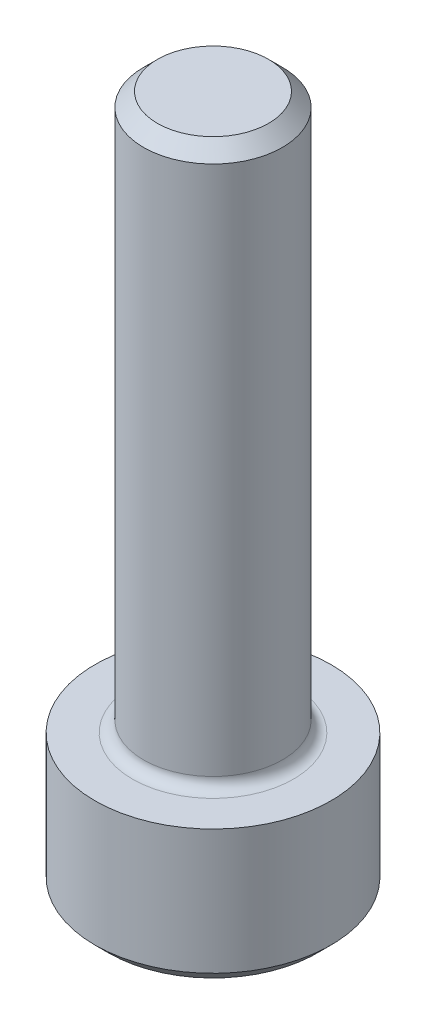
ISO-10303-21;
HEADER;
FILE_DESCRIPTION(('STEP AP214'),'2;1');
FILE_NAME('part.step','',(''),(''),'','','');
FILE_SCHEMA(('AUTOMOTIVE_DESIGN { 1 0 10303 214 1 1 1 1 }'));
ENDSEC;
DATA;
#1=APPLICATION_CONTEXT('core data for automotive mechanical design processes');
#2=APPLICATION_PROTOCOL_DEFINITION('international standard','automotive_design',2000,#1);
#3=PRODUCT_CONTEXT('',#1,'mechanical');
#4=PRODUCT('Part','Part','',(#3));
#5=PRODUCT_RELATED_PRODUCT_CATEGORY('part','',(#4));
#6=PRODUCT_DEFINITION_FORMATION('','',#4);
#7=PRODUCT_DEFINITION_CONTEXT('part definition',#1,'design');
#8=PRODUCT_DEFINITION('design','',#6,#7);
#9=PRODUCT_DEFINITION_SHAPE('','',#8);
#10=(LENGTH_UNIT() NAMED_UNIT(*) SI_UNIT(.MILLI.,.METRE.));
#11=(NAMED_UNIT(*) PLANE_ANGLE_UNIT() SI_UNIT($,.RADIAN.));
#12=(NAMED_UNIT(*) SI_UNIT($,.STERADIAN.) SOLID_ANGLE_UNIT());
#13=UNCERTAINTY_MEASURE_WITH_UNIT(LENGTH_MEASURE(1.E-05),#10,'distance_accuracy_value','');
#14=(GEOMETRIC_REPRESENTATION_CONTEXT(3) GLOBAL_UNCERTAINTY_ASSIGNED_CONTEXT((#13)) GLOBAL_UNIT_ASSIGNED_CONTEXT((#10,
#11,#12)) REPRESENTATION_CONTEXT('',''));
#15=CARTESIAN_POINT('',(0.,0.,0.));
#16=DIRECTION('',(0.,0.,1.));
#17=DIRECTION('',(1.,0.,0.));
#18=AXIS2_PLACEMENT_3D('',#15,#16,#17);
#19=CARTESIAN_POINT('',(0.,20.,0.));
#20=DIRECTION('',(0.,-1.,0.));
#21=DIRECTION('',(0.,0.,-1.));
#22=AXIS2_PLACEMENT_3D('',#19,#20,#21);
#23=CYLINDRICAL_SURFACE('',#22,2.5);
#24=CARTESIAN_POINT('',(0.,19.5,0.));
#25=DIRECTION('',(0.,1.,0.));
#26=DIRECTION('',(0.,0.,1.));
#27=AXIS2_PLACEMENT_3D('',#24,#25,#26);
#28=CIRCLE('',#27,2.5);
#29=CARTESIAN_POINT('',(0.,19.5,2.5));
#30=VERTEX_POINT('',#29);
#31=EDGE_CURVE('E11',#30,#30,#28,.F.);
#32=ORIENTED_EDGE('',*,*,#31,.T.);
#33=EDGE_LOOP('',(#32));
#34=FACE_BOUND('',#33,.T.);
#35=CARTESIAN_POINT('',(0.,0.400000000000001,0.));
#36=DIRECTION('',(0.,1.,0.));
#37=DIRECTION('',(0.,0.,1.));
#38=AXIS2_PLACEMENT_3D('',#35,#36,#37);
#39=CIRCLE('',#38,2.5);
#40=CARTESIAN_POINT('',(0.,0.400000000000001,2.5));
#41=VERTEX_POINT('',#40);
#42=EDGE_CURVE('E143',#41,#41,#39,.T.);
#43=ORIENTED_EDGE('',*,*,#42,.T.);
#44=EDGE_LOOP('',(#43));
#45=FACE_BOUND('',#44,.T.);
#46=ADVANCED_FACE('F33',(#34,#45),#23,.T.);
#47=CARTESIAN_POINT('',(0.,20.,0.));
#48=DIRECTION('',(0.,1.,0.));
#49=DIRECTION('',(0.,0.,1.));
#50=AXIS2_PLACEMENT_3D('',#47,#48,#49);
#51=PLANE('',#50);
#52=CARTESIAN_POINT('',(0.,20.,0.));
#53=DIRECTION('',(0.,1.,0.));
#54=DIRECTION('',(0.,0.,1.));
#55=AXIS2_PLACEMENT_3D('',#52,#53,#54);
#56=CIRCLE('',#55,2.);
#57=CARTESIAN_POINT('',(0.,20.,2.));
#58=VERTEX_POINT('',#57);
#59=EDGE_CURVE('E41',#58,#58,#56,.T.);
#60=ORIENTED_EDGE('',*,*,#59,.T.);
#61=EDGE_LOOP('',(#60));
#62=FACE_BOUND('',#61,.T.);
#63=ADVANCED_FACE('F157',(#62),#51,.T.);
#64=CARTESIAN_POINT('',(0.,-5.,0.));
#65=DIRECTION('',(0.,1.,0.));
#66=DIRECTION('',(0.,0.,1.));
#67=AXIS2_PLACEMENT_3D('',#64,#65,#66);
#68=CYLINDRICAL_SURFACE('',#67,4.25);
#69=CARTESIAN_POINT('',(0.,-4.49999999999999,0.));
#70=DIRECTION('',(0.,1.,0.));
#71=DIRECTION('',(0.,0.,1.));
#72=AXIS2_PLACEMENT_3D('',#69,#70,#71);
#73=CIRCLE('',#72,4.25);
#74=CARTESIAN_POINT('',(0.,-4.49999999999999,4.25));
#75=VERTEX_POINT('',#74);
#76=EDGE_CURVE('E149',#75,#75,#73,.T.);
#77=ORIENTED_EDGE('',*,*,#76,.T.);
#78=EDGE_LOOP('',(#77));
#79=FACE_BOUND('',#78,.T.);
#80=CARTESIAN_POINT('',(0.,0.,0.));
#81=DIRECTION('',(0.,1.,0.));
#82=DIRECTION('',(0.,0.,1.));
#83=AXIS2_PLACEMENT_3D('',#80,#81,#82);
#84=CIRCLE('',#83,4.25);
#85=CARTESIAN_POINT('',(0.,0.,4.25));
#86=VERTEX_POINT('',#85);
#87=EDGE_CURVE('E135',#86,#86,#84,.T.);
#88=ORIENTED_EDGE('',*,*,#87,.F.);
#89=EDGE_LOOP('',(#88));
#90=FACE_BOUND('',#89,.T.);
#91=ADVANCED_FACE('F178',(#79,#90),#68,.T.);
#92=CARTESIAN_POINT('',(0.,-5.,0.));
#93=DIRECTION('',(0.,1.,0.));
#94=DIRECTION('',(0.,0.,1.));
#95=AXIS2_PLACEMENT_3D('',#92,#93,#94);
#96=PLANE('',#95);
#97=DIRECTION('',(-0.866025403784439,0.,-0.5));
#98=VECTOR('',#97,1.);
#99=CARTESIAN_POINT('',(0.,-5.,2.3094010767585));
#100=LINE('',#99,#98);
#101=CARTESIAN_POINT('',(0.,-5.,2.3094010767585));
#102=VERTEX_POINT('',#101);
#103=CARTESIAN_POINT('',(-2.,-5.,1.15470053837925));
#104=VERTEX_POINT('',#103);
#105=EDGE_CURVE('E122',#102,#104,#100,.T.);
#106=ORIENTED_EDGE('',*,*,#105,.F.);
#107=DIRECTION('',(-0.866025403784439,0.,0.5));
#108=VECTOR('',#107,1.);
#109=CARTESIAN_POINT('',(2.,-5.,1.15470053837925));
#110=LINE('',#109,#108);
#111=CARTESIAN_POINT('',(2.,-5.,1.15470053837925));
#112=VERTEX_POINT('',#111);
#113=EDGE_CURVE('E48',#112,#102,#110,.T.);
#114=ORIENTED_EDGE('',*,*,#113,.F.);
#115=DIRECTION('',(0.,0.,1.));
#116=VECTOR('',#115,1.);
#117=CARTESIAN_POINT('',(2.,-5.,-1.15470053837925));
#118=LINE('',#117,#116);
#119=CARTESIAN_POINT('',(2.,-5.,-1.15470053837925));
#120=VERTEX_POINT('',#119);
#121=EDGE_CURVE('E131',#120,#112,#118,.T.);
#122=ORIENTED_EDGE('',*,*,#121,.F.);
#123=DIRECTION('',(0.866025403784439,0.,0.5));
#124=VECTOR('',#123,1.);
#125=CARTESIAN_POINT('',(0.,-5.,-2.3094010767585));
#126=LINE('',#125,#124);
#127=CARTESIAN_POINT('',(0.,-5.,-2.3094010767585));
#128=VERTEX_POINT('',#127);
#129=EDGE_CURVE('E129',#128,#120,#126,.T.);
#130=ORIENTED_EDGE('',*,*,#129,.F.);
#131=DIRECTION('',(0.866025403784439,0.,-0.5));
#132=VECTOR('',#131,1.);
#133=CARTESIAN_POINT('',(-2.,-5.,-1.15470053837925));
#134=LINE('',#133,#132);
#135=CARTESIAN_POINT('',(-2.,-5.,-1.15470053837925));
#136=VERTEX_POINT('',#135);
#137=EDGE_CURVE('E96',#136,#128,#134,.T.);
#138=ORIENTED_EDGE('',*,*,#137,.F.);
#139=DIRECTION('',(0.,0.,-1.));
#140=VECTOR('',#139,1.);
#141=CARTESIAN_POINT('',(-2.,-5.,1.15470053837925));
#142=LINE('',#141,#140);
#143=EDGE_CURVE('E125',#104,#136,#142,.T.);
#144=ORIENTED_EDGE('',*,*,#143,.F.);
#145=EDGE_LOOP('',(#106,#114,#122,#130,#138,#144));
#146=FACE_BOUND('',#145,.T.);
#147=CARTESIAN_POINT('',(0.,-5.,0.));
#148=DIRECTION('',(0.,1.,0.));
#149=DIRECTION('',(0.,0.,1.));
#150=AXIS2_PLACEMENT_3D('',#147,#148,#149);
#151=CIRCLE('',#150,3.75);
#152=CARTESIAN_POINT('',(0.,-5.,3.75));
#153=VERTEX_POINT('',#152);
#154=EDGE_CURVE('E152',#153,#153,#151,.F.);
#155=ORIENTED_EDGE('',*,*,#154,.T.);
#156=EDGE_LOOP('',(#155));
#157=FACE_BOUND('',#156,.T.);
#158=ADVANCED_FACE('F189',(#146,#157),#96,.F.);
#159=CARTESIAN_POINT('',(0.,0.,0.));
#160=DIRECTION('',(0.,1.,0.));
#161=DIRECTION('',(0.,0.,1.));
#162=AXIS2_PLACEMENT_3D('',#159,#160,#161);
#163=PLANE('',#162);
#164=CARTESIAN_POINT('',(0.,0.,0.));
#165=DIRECTION('',(0.,1.,0.));
#166=DIRECTION('',(0.,0.,1.));
#167=AXIS2_PLACEMENT_3D('',#164,#165,#166);
#168=CIRCLE('',#167,2.9);
#169=CARTESIAN_POINT('',(0.,0.,2.9));
#170=VERTEX_POINT('',#169);
#171=EDGE_CURVE('E146',#170,#170,#168,.F.);
#172=ORIENTED_EDGE('',*,*,#171,.T.);
#173=EDGE_LOOP('',(#172));
#174=FACE_BOUND('',#173,.T.);
#175=ORIENTED_EDGE('',*,*,#87,.T.);
#176=EDGE_LOOP('',(#175));
#177=FACE_BOUND('',#176,.T.);
#178=ADVANCED_FACE('F184',(#174,#177),#163,.T.);
#179=CARTESIAN_POINT('',(0.,0.400000000000001,0.));
#180=DIRECTION('',(0.,1.,0.));
#181=DIRECTION('',(0.,0.,1.));
#182=AXIS2_PLACEMENT_3D('',#179,#180,#181);
#183=TOROIDAL_SURFACE('',#182,2.9,0.4);
#184=ORIENTED_EDGE('',*,*,#171,.F.);
#185=EDGE_LOOP('',(#184));
#186=FACE_BOUND('',#185,.T.);
#187=ORIENTED_EDGE('',*,*,#42,.F.);
#188=EDGE_LOOP('',(#187));
#189=FACE_BOUND('',#188,.T.);
#190=ADVANCED_FACE('F169',(#186,#189),#183,.F.);
#191=CARTESIAN_POINT('',(0.,-4.49999999999999,0.));
#192=DIRECTION('',(0.,1.,0.));
#193=DIRECTION('',(0.,0.,1.));
#194=AXIS2_PLACEMENT_3D('',#191,#192,#193);
#195=CONICAL_SURFACE('',#194,4.25,0.785398163397446);
#196=ORIENTED_EDGE('',*,*,#154,.F.);
#197=EDGE_LOOP('',(#196));
#198=FACE_BOUND('',#197,.T.);
#199=ORIENTED_EDGE('',*,*,#76,.F.);
#200=EDGE_LOOP('',(#199));
#201=FACE_BOUND('',#200,.T.);
#202=ADVANCED_FACE('F161',(#198,#201),#195,.T.);
#203=CARTESIAN_POINT('',(0.,20.,0.));
#204=DIRECTION('',(0.,-1.,0.));
#205=DIRECTION('',(0.,0.,-1.));
#206=AXIS2_PLACEMENT_3D('',#203,#204,#205);
#207=CONICAL_SURFACE('',#206,2.,0.785398163397447);
#208=ORIENTED_EDGE('',*,*,#31,.F.);
#209=EDGE_LOOP('',(#208));
#210=FACE_BOUND('',#209,.T.);
#211=ORIENTED_EDGE('',*,*,#59,.F.);
#212=EDGE_LOOP('',(#211));
#213=FACE_BOUND('',#212,.T.);
#214=ADVANCED_FACE('F35',(#210,#213),#207,.T.);
#215=CARTESIAN_POINT('',(2.,-2.5,1.15470053837925));
#216=DIRECTION('',(0.5,0.,0.866025403784439));
#217=DIRECTION('',(0.866025403784439,0.,-0.5));
#218=AXIS2_PLACEMENT_3D('',#215,#216,#217);
#219=PLANE('',#218);
#220=ORIENTED_EDGE('',*,*,#113,.T.);
#221=DIRECTION('',(0.,-1.,0.));
#222=VECTOR('',#221,1.);
#223=CARTESIAN_POINT('',(0.,-2.5,2.3094010767585));
#224=LINE('',#223,#222);
#225=CARTESIAN_POINT('',(0.,-2.5,2.3094010767585));
#226=VERTEX_POINT('',#225);
#227=EDGE_CURVE('E78',#226,#102,#224,.T.);
#228=ORIENTED_EDGE('',*,*,#227,.F.);
#229=DIRECTION('',(-0.866025403784439,0.,0.5));
#230=VECTOR('',#229,1.);
#231=CARTESIAN_POINT('',(2.,-2.5,1.15470053837925));
#232=LINE('',#231,#230);
#233=CARTESIAN_POINT('',(2.,-2.5,1.15470053837925));
#234=VERTEX_POINT('',#233);
#235=EDGE_CURVE('E133',#234,#226,#232,.T.);
#236=ORIENTED_EDGE('',*,*,#235,.F.);
#237=DIRECTION('',(0.,-1.,0.));
#238=VECTOR('',#237,1.);
#239=CARTESIAN_POINT('',(2.,-2.5,1.15470053837925));
#240=LINE('',#239,#238);
#241=EDGE_CURVE('E56',#234,#112,#240,.T.);
#242=ORIENTED_EDGE('',*,*,#241,.T.);
#243=EDGE_LOOP('',(#220,#228,#236,#242));
#244=FACE_BOUND('',#243,.T.);
#245=ADVANCED_FACE('F160',(#244),#219,.F.);
#246=CARTESIAN_POINT('',(2.,-2.5,-1.15470053837925));
#247=DIRECTION('',(1.,0.,0.));
#248=DIRECTION('',(0.,0.,-1.));
#249=AXIS2_PLACEMENT_3D('',#246,#247,#248);
#250=PLANE('',#249);
#251=ORIENTED_EDGE('',*,*,#121,.T.);
#252=ORIENTED_EDGE('',*,*,#241,.F.);
#253=DIRECTION('',(0.,0.,1.));
#254=VECTOR('',#253,1.);
#255=CARTESIAN_POINT('',(2.,-2.5,-1.15470053837925));
#256=LINE('',#255,#254);
#257=CARTESIAN_POINT('',(2.,-2.5,-1.15470053837925));
#258=VERTEX_POINT('',#257);
#259=EDGE_CURVE('E108',#258,#234,#256,.T.);
#260=ORIENTED_EDGE('',*,*,#259,.F.);
#261=DIRECTION('',(0.,-1.,0.));
#262=VECTOR('',#261,1.);
#263=CARTESIAN_POINT('',(2.,-2.5,-1.15470053837925));
#264=LINE('',#263,#262);
#265=EDGE_CURVE('E100',#258,#120,#264,.T.);
#266=ORIENTED_EDGE('',*,*,#265,.T.);
#267=EDGE_LOOP('',(#251,#252,#260,#266));
#268=FACE_BOUND('',#267,.T.);
#269=ADVANCED_FACE('F167',(#268),#250,.F.);
#270=CARTESIAN_POINT('',(0.,-2.5,-2.3094010767585));
#271=DIRECTION('',(0.5,0.,-0.866025403784439));
#272=DIRECTION('',(-0.866025403784439,0.,-0.5));
#273=AXIS2_PLACEMENT_3D('',#270,#271,#272);
#274=PLANE('',#273);
#275=ORIENTED_EDGE('',*,*,#129,.T.);
#276=ORIENTED_EDGE('',*,*,#265,.F.);
#277=DIRECTION('',(0.866025403784439,0.,0.5));
#278=VECTOR('',#277,1.);
#279=CARTESIAN_POINT('',(0.,-2.5,-2.3094010767585));
#280=LINE('',#279,#278);
#281=CARTESIAN_POINT('',(0.,-2.5,-2.3094010767585));
#282=VERTEX_POINT('',#281);
#283=EDGE_CURVE('E104',#282,#258,#280,.T.);
#284=ORIENTED_EDGE('',*,*,#283,.F.);
#285=DIRECTION('',(0.,-1.,0.));
#286=VECTOR('',#285,1.);
#287=CARTESIAN_POINT('',(0.,-2.5,-2.3094010767585));
#288=LINE('',#287,#286);
#289=EDGE_CURVE('E89',#282,#128,#288,.T.);
#290=ORIENTED_EDGE('',*,*,#289,.T.);
#291=EDGE_LOOP('',(#275,#276,#284,#290));
#292=FACE_BOUND('',#291,.T.);
#293=ADVANCED_FACE('F105',(#292),#274,.F.);
#294=CARTESIAN_POINT('',(-2.,-2.5,-1.15470053837925));
#295=DIRECTION('',(-0.5,0.,-0.866025403784439));
#296=DIRECTION('',(-0.866025403784439,0.,0.5));
#297=AXIS2_PLACEMENT_3D('',#294,#295,#296);
#298=PLANE('',#297);
#299=ORIENTED_EDGE('',*,*,#137,.T.);
#300=ORIENTED_EDGE('',*,*,#289,.F.);
#301=DIRECTION('',(0.866025403784439,0.,-0.5));
#302=VECTOR('',#301,1.);
#303=CARTESIAN_POINT('',(-2.,-2.5,-1.15470053837925));
#304=LINE('',#303,#302);
#305=CARTESIAN_POINT('',(-2.,-2.5,-1.15470053837925));
#306=VERTEX_POINT('',#305);
#307=EDGE_CURVE('E93',#306,#282,#304,.T.);
#308=ORIENTED_EDGE('',*,*,#307,.F.);
#309=DIRECTION('',(0.,-1.,0.));
#310=VECTOR('',#309,1.);
#311=CARTESIAN_POINT('',(-2.,-2.5,-1.15470053837925));
#312=LINE('',#311,#310);
#313=EDGE_CURVE('E101',#306,#136,#312,.T.);
#314=ORIENTED_EDGE('',*,*,#313,.T.);
#315=EDGE_LOOP('',(#299,#300,#308,#314));
#316=FACE_BOUND('',#315,.T.);
#317=ADVANCED_FACE('F91',(#316),#298,.F.);
#318=CARTESIAN_POINT('',(-2.,-2.5,1.15470053837925));
#319=DIRECTION('',(-1.,0.,0.));
#320=DIRECTION('',(0.,0.,1.));
#321=AXIS2_PLACEMENT_3D('',#318,#319,#320);
#322=PLANE('',#321);
#323=ORIENTED_EDGE('',*,*,#143,.T.);
#324=ORIENTED_EDGE('',*,*,#313,.F.);
#325=DIRECTION('',(0.,0.,-1.));
#326=VECTOR('',#325,1.);
#327=CARTESIAN_POINT('',(-2.,-2.5,1.15470053837925));
#328=LINE('',#327,#326);
#329=CARTESIAN_POINT('',(-2.,-2.5,1.15470053837925));
#330=VERTEX_POINT('',#329);
#331=EDGE_CURVE('E114',#330,#306,#328,.T.);
#332=ORIENTED_EDGE('',*,*,#331,.F.);
#333=DIRECTION('',(0.,-1.,0.));
#334=VECTOR('',#333,1.);
#335=CARTESIAN_POINT('',(-2.,-2.5,1.15470053837925));
#336=LINE('',#335,#334);
#337=EDGE_CURVE('E138',#330,#104,#336,.T.);
#338=ORIENTED_EDGE('',*,*,#337,.T.);
#339=EDGE_LOOP('',(#323,#324,#332,#338));
#340=FACE_BOUND('',#339,.T.);
#341=ADVANCED_FACE('F209',(#340),#322,.F.);
#342=CARTESIAN_POINT('',(0.,-2.5,2.3094010767585));
#343=DIRECTION('',(-0.5,0.,0.866025403784439));
#344=DIRECTION('',(0.866025403784439,0.,0.5));
#345=AXIS2_PLACEMENT_3D('',#342,#343,#344);
#346=PLANE('',#345);
#347=ORIENTED_EDGE('',*,*,#105,.T.);
#348=ORIENTED_EDGE('',*,*,#337,.F.);
#349=DIRECTION('',(-0.866025403784439,0.,-0.5));
#350=VECTOR('',#349,1.);
#351=CARTESIAN_POINT('',(0.,-2.5,2.3094010767585));
#352=LINE('',#351,#350);
#353=EDGE_CURVE('E116',#226,#330,#352,.T.);
#354=ORIENTED_EDGE('',*,*,#353,.F.);
#355=ORIENTED_EDGE('',*,*,#227,.T.);
#356=EDGE_LOOP('',(#347,#348,#354,#355));
#357=FACE_BOUND('',#356,.T.);
#358=ADVANCED_FACE('F206',(#357),#346,.F.);
#359=CARTESIAN_POINT('',(0.,-2.5,0.));
#360=DIRECTION('',(0.,-1.,0.));
#361=DIRECTION('',(0.,0.,-1.));
#362=AXIS2_PLACEMENT_3D('',#359,#360,#361);
#363=PLANE('',#362);
#364=ORIENTED_EDGE('',*,*,#235,.T.);
#365=ORIENTED_EDGE('',*,*,#353,.T.);
#366=ORIENTED_EDGE('',*,*,#331,.T.);
#367=ORIENTED_EDGE('',*,*,#307,.T.);
#368=ORIENTED_EDGE('',*,*,#283,.T.);
#369=ORIENTED_EDGE('',*,*,#259,.T.);
#370=EDGE_LOOP('',(#364,#365,#366,#367,#368,#369));
#371=FACE_BOUND('',#370,.T.);
#372=ADVANCED_FACE('F111',(#371),#363,.T.);
#373=CLOSED_SHELL('',(#46,#63,#91,#158,#178,#190,#202,#214,#245,#269,#293,#317,#341,#358,#372));
#374=MANIFOLD_SOLID_BREP('B2',#373);
#375=ADVANCED_BREP_SHAPE_REPRESENTATION('',(#18,#374),#14);
#376=SHAPE_DEFINITION_REPRESENTATION(#9,#375);
ENDSEC;
END-ISO-10303-21;
